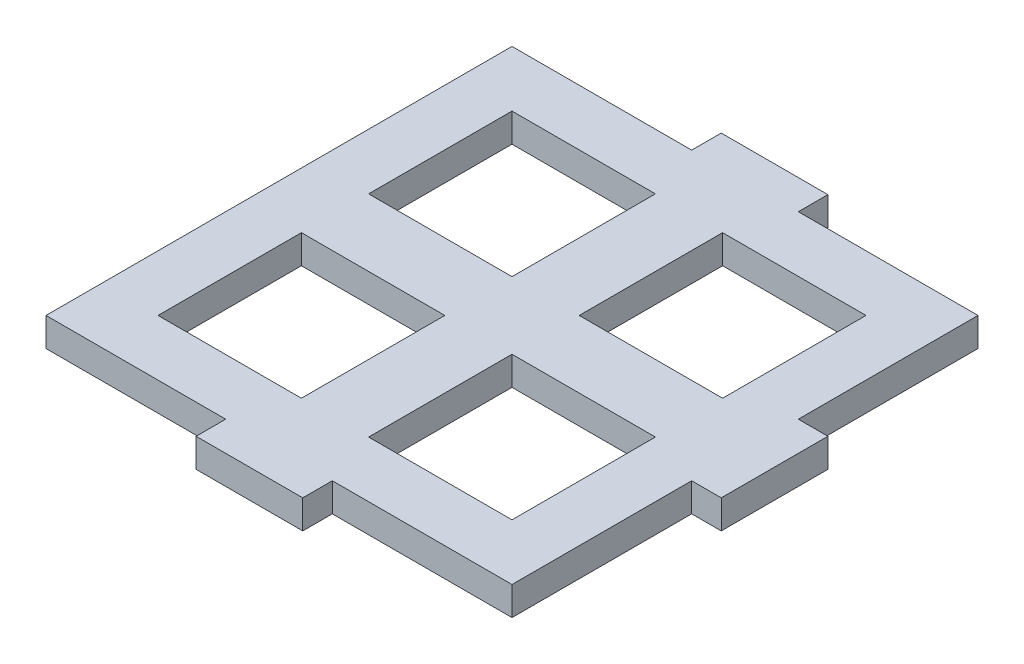
ISO-10303-21;
HEADER;
FILE_DESCRIPTION(('STEP AP214'),'2;1');
FILE_NAME('part.step','',(''),(''),'','','');
FILE_SCHEMA(('AUTOMOTIVE_DESIGN { 1 0 10303 214 1 1 1 1 }'));
ENDSEC;
DATA;
#1=APPLICATION_CONTEXT('core data for automotive mechanical design processes');
#2=APPLICATION_PROTOCOL_DEFINITION('international standard','automotive_design',2000,#1);
#3=PRODUCT_CONTEXT('',#1,'mechanical');
#4=PRODUCT('Part','Part','',(#3));
#5=PRODUCT_RELATED_PRODUCT_CATEGORY('part','',(#4));
#6=PRODUCT_DEFINITION_FORMATION('','',#4);
#7=PRODUCT_DEFINITION_CONTEXT('part definition',#1,'design');
#8=PRODUCT_DEFINITION('design','',#6,#7);
#9=PRODUCT_DEFINITION_SHAPE('','',#8);
#10=(LENGTH_UNIT() NAMED_UNIT(*) SI_UNIT(.MILLI.,.METRE.));
#11=(NAMED_UNIT(*) PLANE_ANGLE_UNIT() SI_UNIT($,.RADIAN.));
#12=(NAMED_UNIT(*) SI_UNIT($,.STERADIAN.) SOLID_ANGLE_UNIT());
#13=UNCERTAINTY_MEASURE_WITH_UNIT(LENGTH_MEASURE(1.E-05),#10,'distance_accuracy_value','');
#14=(GEOMETRIC_REPRESENTATION_CONTEXT(3) GLOBAL_UNCERTAINTY_ASSIGNED_CONTEXT((#13)) GLOBAL_UNIT_ASSIGNED_CONTEXT((#10,
#11,#12)) REPRESENTATION_CONTEXT('',''));
#15=CARTESIAN_POINT('',(0.,0.,0.));
#16=DIRECTION('',(0.,0.,1.));
#17=DIRECTION('',(1.,0.,0.));
#18=AXIS2_PLACEMENT_3D('',#15,#16,#17);
#19=CARTESIAN_POINT('',(21.016,0.,152.654));
#20=DIRECTION('',(0.,0.,1.));
#21=DIRECTION('',(1.,0.,0.));
#22=AXIS2_PLACEMENT_3D('',#19,#20,#21);
#23=PLANE('',#22);
#24=DIRECTION('',(1.,0.,0.));
#25=VECTOR('',#24,1.);
#26=CARTESIAN_POINT('',(21.016,4.064,152.654));
#27=LINE('',#26,#25);
#28=CARTESIAN_POINT('',(61.5925,4.064,152.654));
#29=VERTEX_POINT('',#28);
#30=CARTESIAN_POINT('',(87.056,4.064,152.654));
#31=VERTEX_POINT('',#30);
#32=EDGE_CURVE('E478',#29,#31,#27,.T.);
#33=ORIENTED_EDGE('',*,*,#32,.F.);
#34=DIRECTION('',(0.,-1.,0.));
#35=VECTOR('',#34,1.);
#36=CARTESIAN_POINT('',(61.5925,19.7473430747402,152.654));
#37=LINE('',#36,#35);
#38=CARTESIAN_POINT('',(61.5925,0.,152.654));
#39=VERTEX_POINT('',#38);
#40=EDGE_CURVE('E278',#29,#39,#37,.T.);
#41=ORIENTED_EDGE('',*,*,#40,.T.);
#42=DIRECTION('',(1.,0.,0.));
#43=VECTOR('',#42,1.);
#44=CARTESIAN_POINT('',(21.016,0.,152.654));
#45=LINE('',#44,#43);
#46=CARTESIAN_POINT('',(87.056,0.,152.654));
#47=VERTEX_POINT('',#46);
#48=EDGE_CURVE('E464',#39,#47,#45,.T.);
#49=ORIENTED_EDGE('',*,*,#48,.T.);
#50=DIRECTION('',(0.,1.,0.));
#51=VECTOR('',#50,1.);
#52=CARTESIAN_POINT('',(87.056,0.,152.654));
#53=LINE('',#52,#51);
#54=EDGE_CURVE('E488',#47,#31,#53,.T.);
#55=ORIENTED_EDGE('',*,*,#54,.T.);
#56=EDGE_LOOP('',(#33,#41,#49,#55));
#57=FACE_BOUND('',#56,.T.);
#58=ADVANCED_FACE('F34',(#57),#23,.T.);
#59=CARTESIAN_POINT('',(21.016,0.,86.614));
#60=DIRECTION('',(0.,0.,-1.));
#61=DIRECTION('',(-1.,0.,0.));
#62=AXIS2_PLACEMENT_3D('',#59,#60,#61);
#63=PLANE('',#62);
#64=DIRECTION('',(-1.,0.,0.));
#65=VECTOR('',#64,1.);
#66=CARTESIAN_POINT('',(21.016,4.064,86.614));
#67=LINE('',#66,#65);
#68=CARTESIAN_POINT('',(46.4795,4.064,86.614));
#69=VERTEX_POINT('',#68);
#70=CARTESIAN_POINT('',(21.016,4.064,86.614));
#71=VERTEX_POINT('',#70);
#72=EDGE_CURVE('E484',#69,#71,#67,.T.);
#73=ORIENTED_EDGE('',*,*,#72,.F.);
#74=DIRECTION('',(0.,-1.,0.));
#75=VECTOR('',#74,1.);
#76=CARTESIAN_POINT('',(46.4795,19.7473430747402,86.614));
#77=LINE('',#76,#75);
#78=CARTESIAN_POINT('',(46.4795,0.,86.614));
#79=VERTEX_POINT('',#78);
#80=EDGE_CURVE('E287',#69,#79,#77,.T.);
#81=ORIENTED_EDGE('',*,*,#80,.T.);
#82=DIRECTION('',(-1.,0.,0.));
#83=VECTOR('',#82,1.);
#84=CARTESIAN_POINT('',(21.016,0.,86.614));
#85=LINE('',#84,#83);
#86=CARTESIAN_POINT('',(21.016,0.,86.614));
#87=VERTEX_POINT('',#86);
#88=EDGE_CURVE('E473',#79,#87,#85,.T.);
#89=ORIENTED_EDGE('',*,*,#88,.T.);
#90=DIRECTION('',(0.,1.,0.));
#91=VECTOR('',#90,1.);
#92=CARTESIAN_POINT('',(21.016,0.,86.614));
#93=LINE('',#92,#91);
#94=EDGE_CURVE('E11',#87,#71,#93,.T.);
#95=ORIENTED_EDGE('',*,*,#94,.T.);
#96=EDGE_LOOP('',(#73,#81,#89,#95));
#97=FACE_BOUND('',#96,.T.);
#98=ADVANCED_FACE('F503',(#97),#63,.T.);
#99=CARTESIAN_POINT('',(87.056,0.,86.614));
#100=DIRECTION('',(1.,0.,0.));
#101=DIRECTION('',(0.,0.,-1.));
#102=AXIS2_PLACEMENT_3D('',#99,#100,#101);
#103=PLANE('',#102);
#104=DIRECTION('',(0.,0.,-1.));
#105=VECTOR('',#104,1.);
#106=CARTESIAN_POINT('',(87.056,4.064,86.614));
#107=LINE('',#106,#105);
#108=CARTESIAN_POINT('',(87.0559999999999,4.064,112.0775));
#109=VERTEX_POINT('',#108);
#110=CARTESIAN_POINT('',(87.056,4.064,86.614));
#111=VERTEX_POINT('',#110);
#112=EDGE_CURVE('E480',#109,#111,#107,.T.);
#113=ORIENTED_EDGE('',*,*,#112,.F.);
#114=DIRECTION('',(0.,-1.,0.));
#115=VECTOR('',#114,1.);
#116=CARTESIAN_POINT('',(87.0559999999999,19.7473430747402,112.0775));
#117=LINE('',#116,#115);
#118=CARTESIAN_POINT('',(87.056,0.,112.0775));
#119=VERTEX_POINT('',#118);
#120=EDGE_CURVE('E326',#109,#119,#117,.T.);
#121=ORIENTED_EDGE('',*,*,#120,.T.);
#122=DIRECTION('',(0.,0.,-1.));
#123=VECTOR('',#122,1.);
#124=CARTESIAN_POINT('',(87.056,0.,86.614));
#125=LINE('',#124,#123);
#126=CARTESIAN_POINT('',(87.056,0.,86.614));
#127=VERTEX_POINT('',#126);
#128=EDGE_CURVE('E469',#119,#127,#125,.T.);
#129=ORIENTED_EDGE('',*,*,#128,.T.);
#130=DIRECTION('',(0.,1.,0.));
#131=VECTOR('',#130,1.);
#132=CARTESIAN_POINT('',(87.056,0.,86.614));
#133=LINE('',#132,#131);
#134=EDGE_CURVE('E43',#127,#111,#133,.T.);
#135=ORIENTED_EDGE('',*,*,#134,.T.);
#136=EDGE_LOOP('',(#113,#121,#129,#135));
#137=FACE_BOUND('',#136,.T.);
#138=ADVANCED_FACE('F523',(#137),#103,.T.);
#139=CARTESIAN_POINT('',(21.016,0.,86.614));
#140=DIRECTION('',(-1.,0.,0.));
#141=DIRECTION('',(0.,0.,1.));
#142=AXIS2_PLACEMENT_3D('',#139,#140,#141);
#143=PLANE('',#142);
#144=DIRECTION('',(0.,0.,1.));
#145=VECTOR('',#144,1.);
#146=CARTESIAN_POINT('',(21.016,4.064,86.614));
#147=LINE('',#146,#145);
#148=CARTESIAN_POINT('',(21.016,4.064,152.654));
#149=VERTEX_POINT('',#148);
#150=EDGE_CURVE('E454',#71,#149,#147,.T.);
#151=ORIENTED_EDGE('',*,*,#150,.F.);
#152=ORIENTED_EDGE('',*,*,#94,.F.);
#153=DIRECTION('',(0.,0.,1.));
#154=VECTOR('',#153,1.);
#155=CARTESIAN_POINT('',(21.016,0.,86.614));
#156=LINE('',#155,#154);
#157=CARTESIAN_POINT('',(21.016,0.,152.654));
#158=VERTEX_POINT('',#157);
#159=EDGE_CURVE('E461',#87,#158,#156,.T.);
#160=ORIENTED_EDGE('',*,*,#159,.T.);
#161=DIRECTION('',(0.,1.,0.));
#162=VECTOR('',#161,1.);
#163=CARTESIAN_POINT('',(21.016,0.,152.654));
#164=LINE('',#163,#162);
#165=EDGE_CURVE('E38',#158,#149,#164,.T.);
#166=ORIENTED_EDGE('',*,*,#165,.T.);
#167=EDGE_LOOP('',(#151,#152,#160,#166));
#168=FACE_BOUND('',#167,.T.);
#169=ADVANCED_FACE('F36',(#168),#143,.T.);
#170=DIRECTION('',(0.,-1.,0.));
#171=VECTOR('',#170,1.);
#172=CARTESIAN_POINT('',(61.5925,19.7473430747402,86.614));
#173=LINE('',#172,#171);
#174=CARTESIAN_POINT('',(61.5925,4.064,86.614));
#175=VERTEX_POINT('',#174);
#176=CARTESIAN_POINT('',(61.5925,0.,86.614));
#177=VERTEX_POINT('',#176);
#178=EDGE_CURVE('E293',#175,#177,#173,.T.);
#179=ORIENTED_EDGE('',*,*,#178,.F.);
#180=EDGE_CURVE('E465',#111,#175,#67,.T.);
#181=ORIENTED_EDGE('',*,*,#180,.F.);
#182=ORIENTED_EDGE('',*,*,#134,.F.);
#183=EDGE_CURVE('E474',#127,#177,#85,.T.);
#184=ORIENTED_EDGE('',*,*,#183,.T.);
#185=EDGE_LOOP('',(#179,#181,#182,#184));
#186=FACE_BOUND('',#185,.T.);
#187=ADVANCED_FACE('F525',(#186),#63,.T.);
#188=DIRECTION('',(0.,-1.,0.));
#189=VECTOR('',#188,1.);
#190=CARTESIAN_POINT('',(87.0559999999999,19.7473430747402,127.1905));
#191=LINE('',#190,#189);
#192=CARTESIAN_POINT('',(87.0559999999999,4.064,127.1905));
#193=VERTEX_POINT('',#192);
#194=CARTESIAN_POINT('',(87.0559999999999,0.,127.1905));
#195=VERTEX_POINT('',#194);
#196=EDGE_CURVE('E317',#193,#195,#191,.T.);
#197=ORIENTED_EDGE('',*,*,#196,.F.);
#198=EDGE_CURVE('E481',#31,#193,#107,.T.);
#199=ORIENTED_EDGE('',*,*,#198,.F.);
#200=ORIENTED_EDGE('',*,*,#54,.F.);
#201=EDGE_CURVE('E470',#47,#195,#125,.T.);
#202=ORIENTED_EDGE('',*,*,#201,.T.);
#203=EDGE_LOOP('',(#197,#199,#200,#202));
#204=FACE_BOUND('',#203,.T.);
#205=ADVANCED_FACE('F511',(#204),#103,.T.);
#206=DIRECTION('',(0.,-1.,0.));
#207=VECTOR('',#206,1.);
#208=CARTESIAN_POINT('',(46.4795,19.7473430747402,152.654));
#209=LINE('',#208,#207);
#210=CARTESIAN_POINT('',(46.4795,4.064,152.654));
#211=VERTEX_POINT('',#210);
#212=CARTESIAN_POINT('',(46.4795,0.,152.654));
#213=VERTEX_POINT('',#212);
#214=EDGE_CURVE('E257',#211,#213,#209,.T.);
#215=ORIENTED_EDGE('',*,*,#214,.F.);
#216=EDGE_CURVE('E254',#149,#211,#27,.T.);
#217=ORIENTED_EDGE('',*,*,#216,.F.);
#218=ORIENTED_EDGE('',*,*,#165,.F.);
#219=EDGE_CURVE('E466',#158,#213,#45,.T.);
#220=ORIENTED_EDGE('',*,*,#219,.T.);
#221=EDGE_LOOP('',(#215,#217,#218,#220));
#222=FACE_BOUND('',#221,.T.);
#223=ADVANCED_FACE('F500',(#222),#23,.T.);
#224=CARTESIAN_POINT('',(0.,0.,0.));
#225=DIRECTION('',(0.,1.,0.));
#226=DIRECTION('',(0.,0.,1.));
#227=AXIS2_PLACEMENT_3D('',#224,#225,#226);
#228=PLANE('',#227);
#229=DIRECTION('',(1.,0.,0.));
#230=VECTOR('',#229,1.);
#231=CARTESIAN_POINT('',(58.7984999999999,0.,144.7165));
#232=LINE('',#231,#230);
#233=CARTESIAN_POINT('',(58.7984999999999,0.,144.7165));
#234=VERTEX_POINT('',#233);
#235=CARTESIAN_POINT('',(79.1185,0.,144.7165));
#236=VERTEX_POINT('',#235);
#237=EDGE_CURVE('E343',#234,#236,#232,.T.);
#238=ORIENTED_EDGE('',*,*,#237,.T.);
#239=DIRECTION('',(0.,0.,-1.));
#240=VECTOR('',#239,1.);
#241=CARTESIAN_POINT('',(79.1184999999999,0.,124.3965));
#242=LINE('',#241,#240);
#243=CARTESIAN_POINT('',(79.1184999999999,0.,124.3965));
#244=VERTEX_POINT('',#243);
#245=EDGE_CURVE('E333',#236,#244,#242,.T.);
#246=ORIENTED_EDGE('',*,*,#245,.T.);
#247=DIRECTION('',(-1.,0.,0.));
#248=VECTOR('',#247,1.);
#249=CARTESIAN_POINT('',(58.7984999999999,0.,124.3965));
#250=LINE('',#249,#248);
#251=CARTESIAN_POINT('',(58.7984999999999,0.,124.3965));
#252=VERTEX_POINT('',#251);
#253=EDGE_CURVE('E336',#244,#252,#250,.T.);
#254=ORIENTED_EDGE('',*,*,#253,.T.);
#255=DIRECTION('',(0.,0.,1.));
#256=VECTOR('',#255,1.);
#257=CARTESIAN_POINT('',(58.7984999999999,0.,124.3965));
#258=LINE('',#257,#256);
#259=EDGE_CURVE('E340',#252,#234,#258,.T.);
#260=ORIENTED_EDGE('',*,*,#259,.T.);
#261=EDGE_LOOP('',(#238,#246,#254,#260));
#262=FACE_BOUND('',#261,.T.);
#263=DIRECTION('',(1.,0.,0.));
#264=VECTOR('',#263,1.);
#265=CARTESIAN_POINT('',(28.9534999999999,0.,144.7165));
#266=LINE('',#265,#264);
#267=CARTESIAN_POINT('',(28.9534999999999,0.,144.7165));
#268=VERTEX_POINT('',#267);
#269=CARTESIAN_POINT('',(49.2735,0.,144.7165));
#270=VERTEX_POINT('',#269);
#271=EDGE_CURVE('E375',#268,#270,#266,.T.);
#272=ORIENTED_EDGE('',*,*,#271,.T.);
#273=DIRECTION('',(0.,0.,-1.));
#274=VECTOR('',#273,1.);
#275=CARTESIAN_POINT('',(49.2734999999999,0.,124.3965));
#276=LINE('',#275,#274);
#277=CARTESIAN_POINT('',(49.2734999999999,0.,124.3965));
#278=VERTEX_POINT('',#277);
#279=EDGE_CURVE('E365',#270,#278,#276,.T.);
#280=ORIENTED_EDGE('',*,*,#279,.T.);
#281=DIRECTION('',(-1.,0.,0.));
#282=VECTOR('',#281,1.);
#283=CARTESIAN_POINT('',(28.9534999999999,0.,124.3965));
#284=LINE('',#283,#282);
#285=CARTESIAN_POINT('',(28.9534999999999,0.,124.3965));
#286=VERTEX_POINT('',#285);
#287=EDGE_CURVE('E368',#278,#286,#284,.T.);
#288=ORIENTED_EDGE('',*,*,#287,.T.);
#289=DIRECTION('',(0.,0.,1.));
#290=VECTOR('',#289,1.);
#291=CARTESIAN_POINT('',(28.9534999999999,0.,124.3965));
#292=LINE('',#291,#290);
#293=EDGE_CURVE('E372',#286,#268,#292,.T.);
#294=ORIENTED_EDGE('',*,*,#293,.T.);
#295=EDGE_LOOP('',(#272,#280,#288,#294));
#296=FACE_BOUND('',#295,.T.);
#297=DIRECTION('',(1.,0.,0.));
#298=VECTOR('',#297,1.);
#299=CARTESIAN_POINT('',(58.7984999999999,0.,114.8715));
#300=LINE('',#299,#298);
#301=CARTESIAN_POINT('',(58.7984999999999,0.,114.8715));
#302=VERTEX_POINT('',#301);
#303=CARTESIAN_POINT('',(79.1184999999999,0.,114.8715));
#304=VERTEX_POINT('',#303);
#305=EDGE_CURVE('E407',#302,#304,#300,.T.);
#306=ORIENTED_EDGE('',*,*,#305,.T.);
#307=DIRECTION('',(0.,0.,-1.));
#308=VECTOR('',#307,1.);
#309=CARTESIAN_POINT('',(79.1184999999999,0.,94.5514999999999));
#310=LINE('',#309,#308);
#311=CARTESIAN_POINT('',(79.1184999999999,0.,94.5514999999999));
#312=VERTEX_POINT('',#311);
#313=EDGE_CURVE('E397',#304,#312,#310,.T.);
#314=ORIENTED_EDGE('',*,*,#313,.T.);
#315=DIRECTION('',(-1.,0.,0.));
#316=VECTOR('',#315,1.);
#317=CARTESIAN_POINT('',(58.7984999999999,0.,94.5514999999999));
#318=LINE('',#317,#316);
#319=CARTESIAN_POINT('',(58.7984999999999,0.,94.5514999999999));
#320=VERTEX_POINT('',#319);
#321=EDGE_CURVE('E400',#312,#320,#318,.T.);
#322=ORIENTED_EDGE('',*,*,#321,.T.);
#323=DIRECTION('',(0.,0.,1.));
#324=VECTOR('',#323,1.);
#325=CARTESIAN_POINT('',(58.7984999999999,0.,94.5514999999999));
#326=LINE('',#325,#324);
#327=EDGE_CURVE('E404',#320,#302,#326,.T.);
#328=ORIENTED_EDGE('',*,*,#327,.T.);
#329=EDGE_LOOP('',(#306,#314,#322,#328));
#330=FACE_BOUND('',#329,.T.);
#331=DIRECTION('',(-1.,0.,0.));
#332=VECTOR('',#331,1.);
#333=CARTESIAN_POINT('',(49.2734999999999,0.,94.5514999999999));
#334=LINE('',#333,#332);
#335=CARTESIAN_POINT('',(49.2734999999999,0.,94.5514999999999));
#336=VERTEX_POINT('',#335);
#337=CARTESIAN_POINT('',(28.9534999999999,0.,94.5514999999999));
#338=VERTEX_POINT('',#337);
#339=EDGE_CURVE('E439',#336,#338,#334,.T.);
#340=ORIENTED_EDGE('',*,*,#339,.T.);
#341=DIRECTION('',(0.,0.,1.));
#342=VECTOR('',#341,1.);
#343=CARTESIAN_POINT('',(28.9534999999999,0.,94.5514999999999));
#344=LINE('',#343,#342);
#345=CARTESIAN_POINT('',(28.9534999999999,0.,114.8715));
#346=VERTEX_POINT('',#345);
#347=EDGE_CURVE('E429',#338,#346,#344,.T.);
#348=ORIENTED_EDGE('',*,*,#347,.T.);
#349=DIRECTION('',(1.,0.,0.));
#350=VECTOR('',#349,1.);
#351=CARTESIAN_POINT('',(49.2734999999999,0.,114.8715));
#352=LINE('',#351,#350);
#353=CARTESIAN_POINT('',(49.2734999999999,0.,114.8715));
#354=VERTEX_POINT('',#353);
#355=EDGE_CURVE('E432',#346,#354,#352,.T.);
#356=ORIENTED_EDGE('',*,*,#355,.T.);
#357=DIRECTION('',(0.,0.,-1.));
#358=VECTOR('',#357,1.);
#359=CARTESIAN_POINT('',(49.2734999999999,0.,94.5514999999999));
#360=LINE('',#359,#358);
#361=EDGE_CURVE('E436',#354,#336,#360,.T.);
#362=ORIENTED_EDGE('',*,*,#361,.T.);
#363=EDGE_LOOP('',(#340,#348,#356,#362));
#364=FACE_BOUND('',#363,.T.);
#365=ORIENTED_EDGE('',*,*,#159,.F.);
#366=ORIENTED_EDGE('',*,*,#88,.F.);
#367=DIRECTION('',(0.,0.,-1.));
#368=VECTOR('',#367,1.);
#369=CARTESIAN_POINT('',(46.4795,0.,82.423));
#370=LINE('',#369,#368);
#371=CARTESIAN_POINT('',(46.4795,0.,82.423));
#372=VERTEX_POINT('',#371);
#373=EDGE_CURVE('E59',#79,#372,#370,.T.);
#374=ORIENTED_EDGE('',*,*,#373,.T.);
#375=DIRECTION('',(1.,0.,0.));
#376=VECTOR('',#375,1.);
#377=CARTESIAN_POINT('',(61.5925,0.,82.423));
#378=LINE('',#377,#376);
#379=CARTESIAN_POINT('',(61.5925,0.,82.423));
#380=VERTEX_POINT('',#379);
#381=EDGE_CURVE('E284',#372,#380,#378,.T.);
#382=ORIENTED_EDGE('',*,*,#381,.T.);
#383=DIRECTION('',(0.,0.,1.));
#384=VECTOR('',#383,1.);
#385=CARTESIAN_POINT('',(61.5925,0.,82.423));
#386=LINE('',#385,#384);
#387=EDGE_CURVE('E283',#380,#177,#386,.T.);
#388=ORIENTED_EDGE('',*,*,#387,.T.);
#389=ORIENTED_EDGE('',*,*,#183,.F.);
#390=ORIENTED_EDGE('',*,*,#128,.F.);
#391=DIRECTION('',(1.,0.,0.));
#392=VECTOR('',#391,1.);
#393=CARTESIAN_POINT('',(91.2469999999999,0.,112.0775));
#394=LINE('',#393,#392);
#395=CARTESIAN_POINT('',(91.2469999999999,0.,112.0775));
#396=VERTEX_POINT('',#395);
#397=EDGE_CURVE('E307',#119,#396,#394,.T.);
#398=ORIENTED_EDGE('',*,*,#397,.T.);
#399=DIRECTION('',(0.,0.,1.));
#400=VECTOR('',#399,1.);
#401=CARTESIAN_POINT('',(91.2469999999999,0.,112.0775));
#402=LINE('',#401,#400);
#403=CARTESIAN_POINT('',(91.2469999999999,0.,127.1905));
#404=VERTEX_POINT('',#403);
#405=EDGE_CURVE('E306',#396,#404,#402,.T.);
#406=ORIENTED_EDGE('',*,*,#405,.T.);
#407=DIRECTION('',(-1.,0.,0.));
#408=VECTOR('',#407,1.);
#409=CARTESIAN_POINT('',(91.2469999999999,0.,127.1905));
#410=LINE('',#409,#408);
#411=EDGE_CURVE('E311',#404,#195,#410,.T.);
#412=ORIENTED_EDGE('',*,*,#411,.T.);
#413=ORIENTED_EDGE('',*,*,#201,.F.);
#414=ORIENTED_EDGE('',*,*,#48,.F.);
#415=DIRECTION('',(0.,0.,1.));
#416=VECTOR('',#415,1.);
#417=CARTESIAN_POINT('',(61.5925,0.,152.654));
#418=LINE('',#417,#416);
#419=CARTESIAN_POINT('',(61.5925,0.,156.845));
#420=VERTEX_POINT('',#419);
#421=EDGE_CURVE('E51',#39,#420,#418,.T.);
#422=ORIENTED_EDGE('',*,*,#421,.T.);
#423=DIRECTION('',(-1.,0.,0.));
#424=VECTOR('',#423,1.);
#425=CARTESIAN_POINT('',(61.5925,0.,156.845));
#426=LINE('',#425,#424);
#427=CARTESIAN_POINT('',(46.4795,0.,156.845));
#428=VERTEX_POINT('',#427);
#429=EDGE_CURVE('E272',#420,#428,#426,.T.);
#430=ORIENTED_EDGE('',*,*,#429,.T.);
#431=DIRECTION('',(0.,0.,-1.));
#432=VECTOR('',#431,1.);
#433=CARTESIAN_POINT('',(46.4795,0.,152.654));
#434=LINE('',#433,#432);
#435=EDGE_CURVE('E263',#428,#213,#434,.T.);
#436=ORIENTED_EDGE('',*,*,#435,.T.);
#437=ORIENTED_EDGE('',*,*,#219,.F.);
#438=EDGE_LOOP('',(#365,#366,#374,#382,#388,#389,#390,#398,#406,#412,#413,#414,#422,#430,#436,#437));
#439=FACE_BOUND('',#438,.T.);
#440=ADVANCED_FACE('F506',(#262,#296,#330,#364,#439),#228,.F.);
#441=CARTESIAN_POINT('',(0.,4.064,0.));
#442=DIRECTION('',(0.,1.,0.));
#443=DIRECTION('',(0.,0.,1.));
#444=AXIS2_PLACEMENT_3D('',#441,#442,#443);
#445=PLANE('',#444);
#446=DIRECTION('',(0.,0.,-1.));
#447=VECTOR('',#446,1.);
#448=CARTESIAN_POINT('',(79.1184999999999,4.064,124.3965));
#449=LINE('',#448,#447);
#450=CARTESIAN_POINT('',(79.1185,4.064,144.7165));
#451=VERTEX_POINT('',#450);
#452=CARTESIAN_POINT('',(79.1184999999999,4.064,124.3965));
#453=VERTEX_POINT('',#452);
#454=EDGE_CURVE('E332',#451,#453,#449,.T.);
#455=ORIENTED_EDGE('',*,*,#454,.F.);
#456=DIRECTION('',(1.,0.,0.));
#457=VECTOR('',#456,1.);
#458=CARTESIAN_POINT('',(58.7984999999999,4.064,144.7165));
#459=LINE('',#458,#457);
#460=CARTESIAN_POINT('',(58.7984999999999,4.064,144.7165));
#461=VERTEX_POINT('',#460);
#462=EDGE_CURVE('E337',#461,#451,#459,.T.);
#463=ORIENTED_EDGE('',*,*,#462,.F.);
#464=DIRECTION('',(0.,0.,1.));
#465=VECTOR('',#464,1.);
#466=CARTESIAN_POINT('',(58.7984999999999,4.064,124.3965));
#467=LINE('',#466,#465);
#468=CARTESIAN_POINT('',(58.7984999999999,4.064,124.3965));
#469=VERTEX_POINT('',#468);
#470=EDGE_CURVE('E351',#469,#461,#467,.T.);
#471=ORIENTED_EDGE('',*,*,#470,.F.);
#472=DIRECTION('',(-1.,0.,0.));
#473=VECTOR('',#472,1.);
#474=CARTESIAN_POINT('',(58.7984999999999,4.064,124.3965));
#475=LINE('',#474,#473);
#476=EDGE_CURVE('E348',#453,#469,#475,.T.);
#477=ORIENTED_EDGE('',*,*,#476,.F.);
#478=EDGE_LOOP('',(#455,#463,#471,#477));
#479=FACE_BOUND('',#478,.T.);
#480=DIRECTION('',(0.,0.,-1.));
#481=VECTOR('',#480,1.);
#482=CARTESIAN_POINT('',(49.2734999999999,4.064,124.3965));
#483=LINE('',#482,#481);
#484=CARTESIAN_POINT('',(49.2735,4.064,144.7165));
#485=VERTEX_POINT('',#484);
#486=CARTESIAN_POINT('',(49.2734999999999,4.064,124.3965));
#487=VERTEX_POINT('',#486);
#488=EDGE_CURVE('E358',#485,#487,#483,.T.);
#489=ORIENTED_EDGE('',*,*,#488,.F.);
#490=DIRECTION('',(1.,0.,0.));
#491=VECTOR('',#490,1.);
#492=CARTESIAN_POINT('',(28.9534999999999,4.064,144.7165));
#493=LINE('',#492,#491);
#494=CARTESIAN_POINT('',(28.9534999999999,4.064,144.7165));
#495=VERTEX_POINT('',#494);
#496=EDGE_CURVE('E369',#495,#485,#493,.T.);
#497=ORIENTED_EDGE('',*,*,#496,.F.);
#498=DIRECTION('',(0.,0.,1.));
#499=VECTOR('',#498,1.);
#500=CARTESIAN_POINT('',(28.9534999999999,4.064,124.3965));
#501=LINE('',#500,#499);
#502=CARTESIAN_POINT('',(28.9534999999999,4.064,124.3965));
#503=VERTEX_POINT('',#502);
#504=EDGE_CURVE('E383',#503,#495,#501,.T.);
#505=ORIENTED_EDGE('',*,*,#504,.F.);
#506=DIRECTION('',(-1.,0.,0.));
#507=VECTOR('',#506,1.);
#508=CARTESIAN_POINT('',(28.9534999999999,4.064,124.3965));
#509=LINE('',#508,#507);
#510=EDGE_CURVE('E380',#487,#503,#509,.T.);
#511=ORIENTED_EDGE('',*,*,#510,.F.);
#512=EDGE_LOOP('',(#489,#497,#505,#511));
#513=FACE_BOUND('',#512,.T.);
#514=DIRECTION('',(0.,0.,-1.));
#515=VECTOR('',#514,1.);
#516=CARTESIAN_POINT('',(79.1184999999999,4.064,94.5514999999999));
#517=LINE('',#516,#515);
#518=CARTESIAN_POINT('',(79.1184999999999,4.064,114.8715));
#519=VERTEX_POINT('',#518);
#520=CARTESIAN_POINT('',(79.1184999999999,4.064,94.5514999999999));
#521=VERTEX_POINT('',#520);
#522=EDGE_CURVE('E390',#519,#521,#517,.T.);
#523=ORIENTED_EDGE('',*,*,#522,.F.);
#524=DIRECTION('',(1.,0.,0.));
#525=VECTOR('',#524,1.);
#526=CARTESIAN_POINT('',(58.7984999999999,4.064,114.8715));
#527=LINE('',#526,#525);
#528=CARTESIAN_POINT('',(58.7984999999999,4.064,114.8715));
#529=VERTEX_POINT('',#528);
#530=EDGE_CURVE('E401',#529,#519,#527,.T.);
#531=ORIENTED_EDGE('',*,*,#530,.F.);
#532=DIRECTION('',(0.,0.,1.));
#533=VECTOR('',#532,1.);
#534=CARTESIAN_POINT('',(58.7984999999999,4.064,94.5514999999999));
#535=LINE('',#534,#533);
#536=CARTESIAN_POINT('',(58.7984999999999,4.064,94.5514999999999));
#537=VERTEX_POINT('',#536);
#538=EDGE_CURVE('E415',#537,#529,#535,.T.);
#539=ORIENTED_EDGE('',*,*,#538,.F.);
#540=DIRECTION('',(-1.,0.,0.));
#541=VECTOR('',#540,1.);
#542=CARTESIAN_POINT('',(58.7984999999999,4.064,94.5514999999999));
#543=LINE('',#542,#541);
#544=EDGE_CURVE('E412',#521,#537,#543,.T.);
#545=ORIENTED_EDGE('',*,*,#544,.F.);
#546=EDGE_LOOP('',(#523,#531,#539,#545));
#547=FACE_BOUND('',#546,.T.);
#548=DIRECTION('',(0.,0.,1.));
#549=VECTOR('',#548,1.);
#550=CARTESIAN_POINT('',(28.9534999999999,4.064,94.5514999999999));
#551=LINE('',#550,#549);
#552=CARTESIAN_POINT('',(28.9534999999999,4.064,94.5514999999999));
#553=VERTEX_POINT('',#552);
#554=CARTESIAN_POINT('',(28.9534999999999,4.064,114.8715));
#555=VERTEX_POINT('',#554);
#556=EDGE_CURVE('E422',#553,#555,#551,.T.);
#557=ORIENTED_EDGE('',*,*,#556,.F.);
#558=DIRECTION('',(-1.,0.,0.));
#559=VECTOR('',#558,1.);
#560=CARTESIAN_POINT('',(49.2734999999999,4.064,94.5514999999999));
#561=LINE('',#560,#559);
#562=CARTESIAN_POINT('',(49.2734999999999,4.064,94.5514999999999));
#563=VERTEX_POINT('',#562);
#564=EDGE_CURVE('E433',#563,#553,#561,.T.);
#565=ORIENTED_EDGE('',*,*,#564,.F.);
#566=DIRECTION('',(0.,0.,-1.));
#567=VECTOR('',#566,1.);
#568=CARTESIAN_POINT('',(49.2734999999999,4.064,94.5514999999999));
#569=LINE('',#568,#567);
#570=CARTESIAN_POINT('',(49.2734999999999,4.064,114.8715));
#571=VERTEX_POINT('',#570);
#572=EDGE_CURVE('E447',#571,#563,#569,.T.);
#573=ORIENTED_EDGE('',*,*,#572,.F.);
#574=DIRECTION('',(1.,0.,0.));
#575=VECTOR('',#574,1.);
#576=CARTESIAN_POINT('',(49.2734999999999,4.064,114.8715));
#577=LINE('',#576,#575);
#578=EDGE_CURVE('E444',#555,#571,#577,.T.);
#579=ORIENTED_EDGE('',*,*,#578,.F.);
#580=EDGE_LOOP('',(#557,#565,#573,#579));
#581=FACE_BOUND('',#580,.T.);
#582=ORIENTED_EDGE('',*,*,#150,.T.);
#583=ORIENTED_EDGE('',*,*,#216,.T.);
#584=DIRECTION('',(0.,0.,-1.));
#585=VECTOR('',#584,1.);
#586=CARTESIAN_POINT('',(46.4795,4.064,152.654));
#587=LINE('',#586,#585);
#588=CARTESIAN_POINT('',(46.4795,4.064,156.845));
#589=VERTEX_POINT('',#588);
#590=EDGE_CURVE('E246',#589,#211,#587,.T.);
#591=ORIENTED_EDGE('',*,*,#590,.F.);
#592=DIRECTION('',(-1.,0.,0.));
#593=VECTOR('',#592,1.);
#594=CARTESIAN_POINT('',(61.5925,4.064,156.845));
#595=LINE('',#594,#593);
#596=CARTESIAN_POINT('',(61.5925,4.064,156.845));
#597=VERTEX_POINT('',#596);
#598=EDGE_CURVE('E251',#597,#589,#595,.T.);
#599=ORIENTED_EDGE('',*,*,#598,.F.);
#600=DIRECTION('',(0.,0.,1.));
#601=VECTOR('',#600,1.);
#602=CARTESIAN_POINT('',(61.5925,4.064,152.654));
#603=LINE('',#602,#601);
#604=EDGE_CURVE('E277',#29,#597,#603,.T.);
#605=ORIENTED_EDGE('',*,*,#604,.F.);
#606=ORIENTED_EDGE('',*,*,#32,.T.);
#607=ORIENTED_EDGE('',*,*,#198,.T.);
#608=DIRECTION('',(-1.,0.,0.));
#609=VECTOR('',#608,1.);
#610=CARTESIAN_POINT('',(91.2469999999999,4.064,127.1905));
#611=LINE('',#610,#609);
#612=CARTESIAN_POINT('',(91.2469999999999,4.064,127.1905));
#613=VERTEX_POINT('',#612);
#614=EDGE_CURVE('E310',#613,#193,#611,.T.);
#615=ORIENTED_EDGE('',*,*,#614,.F.);
#616=DIRECTION('',(0.,0.,1.));
#617=VECTOR('',#616,1.);
#618=CARTESIAN_POINT('',(91.2469999999999,4.064,112.0775));
#619=LINE('',#618,#617);
#620=CARTESIAN_POINT('',(91.2469999999999,4.064,112.0775));
#621=VERTEX_POINT('',#620);
#622=EDGE_CURVE('E318',#621,#613,#619,.T.);
#623=ORIENTED_EDGE('',*,*,#622,.F.);
#624=DIRECTION('',(1.,0.,0.));
#625=VECTOR('',#624,1.);
#626=CARTESIAN_POINT('',(91.2469999999999,4.064,112.0775));
#627=LINE('',#626,#625);
#628=EDGE_CURVE('E323',#109,#621,#627,.T.);
#629=ORIENTED_EDGE('',*,*,#628,.F.);
#630=ORIENTED_EDGE('',*,*,#112,.T.);
#631=ORIENTED_EDGE('',*,*,#180,.T.);
#632=DIRECTION('',(0.,0.,1.));
#633=VECTOR('',#632,1.);
#634=CARTESIAN_POINT('',(61.5925,4.064,82.423));
#635=LINE('',#634,#633);
#636=CARTESIAN_POINT('',(61.5925,4.064,82.423));
#637=VERTEX_POINT('',#636);
#638=EDGE_CURVE('E291',#637,#175,#635,.T.);
#639=ORIENTED_EDGE('',*,*,#638,.F.);
#640=DIRECTION('',(1.,0.,0.));
#641=VECTOR('',#640,1.);
#642=CARTESIAN_POINT('',(61.5925,4.064,82.423));
#643=LINE('',#642,#641);
#644=CARTESIAN_POINT('',(46.4795,4.064,82.423));
#645=VERTEX_POINT('',#644);
#646=EDGE_CURVE('E295',#645,#637,#643,.T.);
#647=ORIENTED_EDGE('',*,*,#646,.F.);
#648=DIRECTION('',(0.,0.,-1.));
#649=VECTOR('',#648,1.);
#650=CARTESIAN_POINT('',(46.4795,4.064,82.423));
#651=LINE('',#650,#649);
#652=EDGE_CURVE('E299',#69,#645,#651,.T.);
#653=ORIENTED_EDGE('',*,*,#652,.F.);
#654=ORIENTED_EDGE('',*,*,#72,.T.);
#655=EDGE_LOOP('',(#582,#583,#591,#599,#605,#606,#607,#615,#623,#629,#630,#631,#639,#647,#653,#654));
#656=FACE_BOUND('',#655,.T.);
#657=ADVANCED_FACE('F249',(#479,#513,#547,#581,#656),#445,.T.);
#658=CARTESIAN_POINT('',(28.9534999999999,0.,94.5514999999999));
#659=DIRECTION('',(-1.,0.,0.));
#660=DIRECTION('',(0.,0.,1.));
#661=AXIS2_PLACEMENT_3D('',#658,#659,#660);
#662=PLANE('',#661);
#663=ORIENTED_EDGE('',*,*,#556,.T.);
#664=DIRECTION('',(0.,1.,0.));
#665=VECTOR('',#664,1.);
#666=CARTESIAN_POINT('',(28.9534999999999,0.,114.8715));
#667=LINE('',#666,#665);
#668=EDGE_CURVE('E442',#346,#555,#667,.T.);
#669=ORIENTED_EDGE('',*,*,#668,.F.);
#670=ORIENTED_EDGE('',*,*,#347,.F.);
#671=DIRECTION('',(0.,1.,0.));
#672=VECTOR('',#671,1.);
#673=CARTESIAN_POINT('',(28.9534999999999,0.,94.5514999999999));
#674=LINE('',#673,#672);
#675=EDGE_CURVE('E452',#338,#553,#674,.T.);
#676=ORIENTED_EDGE('',*,*,#675,.T.);
#677=EDGE_LOOP('',(#663,#669,#670,#676));
#678=FACE_BOUND('',#677,.T.);
#679=ADVANCED_FACE('F634',(#678),#662,.F.);
#680=CARTESIAN_POINT('',(49.2734999999999,0.,94.5514999999999));
#681=DIRECTION('',(0.,0.,-1.));
#682=DIRECTION('',(-1.,0.,0.));
#683=AXIS2_PLACEMENT_3D('',#680,#681,#682);
#684=PLANE('',#683);
#685=ORIENTED_EDGE('',*,*,#564,.T.);
#686=ORIENTED_EDGE('',*,*,#675,.F.);
#687=ORIENTED_EDGE('',*,*,#339,.F.);
#688=DIRECTION('',(0.,1.,0.));
#689=VECTOR('',#688,1.);
#690=CARTESIAN_POINT('',(49.2734999999999,0.,94.5514999999999));
#691=LINE('',#690,#689);
#692=EDGE_CURVE('E455',#336,#563,#691,.T.);
#693=ORIENTED_EDGE('',*,*,#692,.T.);
#694=EDGE_LOOP('',(#685,#686,#687,#693));
#695=FACE_BOUND('',#694,.T.);
#696=ADVANCED_FACE('F630',(#695),#684,.F.);
#697=CARTESIAN_POINT('',(49.2734999999999,0.,94.5514999999999));
#698=DIRECTION('',(1.,0.,0.));
#699=DIRECTION('',(0.,0.,-1.));
#700=AXIS2_PLACEMENT_3D('',#697,#698,#699);
#701=PLANE('',#700);
#702=ORIENTED_EDGE('',*,*,#572,.T.);
#703=ORIENTED_EDGE('',*,*,#692,.F.);
#704=ORIENTED_EDGE('',*,*,#361,.F.);
#705=DIRECTION('',(0.,1.,0.));
#706=VECTOR('',#705,1.);
#707=CARTESIAN_POINT('',(49.2734999999999,0.,114.8715));
#708=LINE('',#707,#706);
#709=EDGE_CURVE('E457',#354,#571,#708,.T.);
#710=ORIENTED_EDGE('',*,*,#709,.T.);
#711=EDGE_LOOP('',(#702,#703,#704,#710));
#712=FACE_BOUND('',#711,.T.);
#713=ADVANCED_FACE('F633',(#712),#701,.F.);
#714=CARTESIAN_POINT('',(49.2734999999999,0.,114.8715));
#715=DIRECTION('',(0.,0.,1.));
#716=DIRECTION('',(1.,0.,0.));
#717=AXIS2_PLACEMENT_3D('',#714,#715,#716);
#718=PLANE('',#717);
#719=ORIENTED_EDGE('',*,*,#578,.T.);
#720=ORIENTED_EDGE('',*,*,#709,.F.);
#721=ORIENTED_EDGE('',*,*,#355,.F.);
#722=ORIENTED_EDGE('',*,*,#668,.T.);
#723=EDGE_LOOP('',(#719,#720,#721,#722));
#724=FACE_BOUND('',#723,.T.);
#725=ADVANCED_FACE('F628',(#724),#718,.F.);
#726=CARTESIAN_POINT('',(79.1184999999999,0.,94.5514999999999));
#727=DIRECTION('',(1.,0.,0.));
#728=DIRECTION('',(0.,0.,-1.));
#729=AXIS2_PLACEMENT_3D('',#726,#727,#728);
#730=PLANE('',#729);
#731=ORIENTED_EDGE('',*,*,#522,.T.);
#732=DIRECTION('',(0.,1.,0.));
#733=VECTOR('',#732,1.);
#734=CARTESIAN_POINT('',(79.1184999999999,0.,94.5514999999999));
#735=LINE('',#734,#733);
#736=EDGE_CURVE('E410',#312,#521,#735,.T.);
#737=ORIENTED_EDGE('',*,*,#736,.F.);
#738=ORIENTED_EDGE('',*,*,#313,.F.);
#739=DIRECTION('',(0.,1.,0.));
#740=VECTOR('',#739,1.);
#741=CARTESIAN_POINT('',(79.1184999999999,0.,114.8715));
#742=LINE('',#741,#740);
#743=EDGE_CURVE('E420',#304,#519,#742,.T.);
#744=ORIENTED_EDGE('',*,*,#743,.T.);
#745=EDGE_LOOP('',(#731,#737,#738,#744));
#746=FACE_BOUND('',#745,.T.);
#747=ADVANCED_FACE('F618',(#746),#730,.F.);
#748=CARTESIAN_POINT('',(58.7984999999999,0.,114.8715));
#749=DIRECTION('',(0.,0.,1.));
#750=DIRECTION('',(1.,0.,0.));
#751=AXIS2_PLACEMENT_3D('',#748,#749,#750);
#752=PLANE('',#751);
#753=ORIENTED_EDGE('',*,*,#530,.T.);
#754=ORIENTED_EDGE('',*,*,#743,.F.);
#755=ORIENTED_EDGE('',*,*,#305,.F.);
#756=DIRECTION('',(0.,1.,0.));
#757=VECTOR('',#756,1.);
#758=CARTESIAN_POINT('',(58.7984999999999,0.,114.8715));
#759=LINE('',#758,#757);
#760=EDGE_CURVE('E423',#302,#529,#759,.T.);
#761=ORIENTED_EDGE('',*,*,#760,.T.);
#762=EDGE_LOOP('',(#753,#754,#755,#761));
#763=FACE_BOUND('',#762,.T.);
#764=ADVANCED_FACE('F614',(#763),#752,.F.);
#765=CARTESIAN_POINT('',(58.7984999999999,0.,94.5514999999999));
#766=DIRECTION('',(-1.,0.,0.));
#767=DIRECTION('',(0.,0.,1.));
#768=AXIS2_PLACEMENT_3D('',#765,#766,#767);
#769=PLANE('',#768);
#770=ORIENTED_EDGE('',*,*,#538,.T.);
#771=ORIENTED_EDGE('',*,*,#760,.F.);
#772=ORIENTED_EDGE('',*,*,#327,.F.);
#773=DIRECTION('',(0.,1.,0.));
#774=VECTOR('',#773,1.);
#775=CARTESIAN_POINT('',(58.7984999999999,0.,94.5514999999999));
#776=LINE('',#775,#774);
#777=EDGE_CURVE('E425',#320,#537,#776,.T.);
#778=ORIENTED_EDGE('',*,*,#777,.T.);
#779=EDGE_LOOP('',(#770,#771,#772,#778));
#780=FACE_BOUND('',#779,.T.);
#781=ADVANCED_FACE('F617',(#780),#769,.F.);
#782=CARTESIAN_POINT('',(58.7984999999999,0.,94.5514999999999));
#783=DIRECTION('',(0.,0.,-1.));
#784=DIRECTION('',(-1.,0.,0.));
#785=AXIS2_PLACEMENT_3D('',#782,#783,#784);
#786=PLANE('',#785);
#787=ORIENTED_EDGE('',*,*,#544,.T.);
#788=ORIENTED_EDGE('',*,*,#777,.F.);
#789=ORIENTED_EDGE('',*,*,#321,.F.);
#790=ORIENTED_EDGE('',*,*,#736,.T.);
#791=EDGE_LOOP('',(#787,#788,#789,#790));
#792=FACE_BOUND('',#791,.T.);
#793=ADVANCED_FACE('F612',(#792),#786,.F.);
#794=CARTESIAN_POINT('',(49.2734999999999,0.,124.3965));
#795=DIRECTION('',(1.,0.,0.));
#796=DIRECTION('',(0.,0.,-1.));
#797=AXIS2_PLACEMENT_3D('',#794,#795,#796);
#798=PLANE('',#797);
#799=ORIENTED_EDGE('',*,*,#488,.T.);
#800=DIRECTION('',(0.,1.,0.));
#801=VECTOR('',#800,1.);
#802=CARTESIAN_POINT('',(49.2734999999999,0.,124.3965));
#803=LINE('',#802,#801);
#804=EDGE_CURVE('E378',#278,#487,#803,.T.);
#805=ORIENTED_EDGE('',*,*,#804,.F.);
#806=ORIENTED_EDGE('',*,*,#279,.F.);
#807=DIRECTION('',(0.,1.,0.));
#808=VECTOR('',#807,1.);
#809=CARTESIAN_POINT('',(49.2735,0.,144.7165));
#810=LINE('',#809,#808);
#811=EDGE_CURVE('E388',#270,#485,#810,.T.);
#812=ORIENTED_EDGE('',*,*,#811,.T.);
#813=EDGE_LOOP('',(#799,#805,#806,#812));
#814=FACE_BOUND('',#813,.T.);
#815=ADVANCED_FACE('F602',(#814),#798,.F.);
#816=CARTESIAN_POINT('',(28.9534999999999,0.,144.7165));
#817=DIRECTION('',(0.,0.,1.));
#818=DIRECTION('',(1.,0.,0.));
#819=AXIS2_PLACEMENT_3D('',#816,#817,#818);
#820=PLANE('',#819);
#821=ORIENTED_EDGE('',*,*,#496,.T.);
#822=ORIENTED_EDGE('',*,*,#811,.F.);
#823=ORIENTED_EDGE('',*,*,#271,.F.);
#824=DIRECTION('',(0.,1.,0.));
#825=VECTOR('',#824,1.);
#826=CARTESIAN_POINT('',(28.9534999999999,0.,144.7165));
#827=LINE('',#826,#825);
#828=EDGE_CURVE('E391',#268,#495,#827,.T.);
#829=ORIENTED_EDGE('',*,*,#828,.T.);
#830=EDGE_LOOP('',(#821,#822,#823,#829));
#831=FACE_BOUND('',#830,.T.);
#832=ADVANCED_FACE('F598',(#831),#820,.F.);
#833=CARTESIAN_POINT('',(28.9534999999999,0.,124.3965));
#834=DIRECTION('',(-1.,0.,0.));
#835=DIRECTION('',(0.,0.,1.));
#836=AXIS2_PLACEMENT_3D('',#833,#834,#835);
#837=PLANE('',#836);
#838=ORIENTED_EDGE('',*,*,#504,.T.);
#839=ORIENTED_EDGE('',*,*,#828,.F.);
#840=ORIENTED_EDGE('',*,*,#293,.F.);
#841=DIRECTION('',(0.,1.,0.));
#842=VECTOR('',#841,1.);
#843=CARTESIAN_POINT('',(28.9534999999999,0.,124.3965));
#844=LINE('',#843,#842);
#845=EDGE_CURVE('E393',#286,#503,#844,.T.);
#846=ORIENTED_EDGE('',*,*,#845,.T.);
#847=EDGE_LOOP('',(#838,#839,#840,#846));
#848=FACE_BOUND('',#847,.T.);
#849=ADVANCED_FACE('F601',(#848),#837,.F.);
#850=CARTESIAN_POINT('',(28.9534999999999,0.,124.3965));
#851=DIRECTION('',(0.,0.,-1.));
#852=DIRECTION('',(-1.,0.,0.));
#853=AXIS2_PLACEMENT_3D('',#850,#851,#852);
#854=PLANE('',#853);
#855=ORIENTED_EDGE('',*,*,#510,.T.);
#856=ORIENTED_EDGE('',*,*,#845,.F.);
#857=ORIENTED_EDGE('',*,*,#287,.F.);
#858=ORIENTED_EDGE('',*,*,#804,.T.);
#859=EDGE_LOOP('',(#855,#856,#857,#858));
#860=FACE_BOUND('',#859,.T.);
#861=ADVANCED_FACE('F596',(#860),#854,.F.);
#862=CARTESIAN_POINT('',(79.1184999999999,0.,124.3965));
#863=DIRECTION('',(1.,0.,0.));
#864=DIRECTION('',(0.,0.,-1.));
#865=AXIS2_PLACEMENT_3D('',#862,#863,#864);
#866=PLANE('',#865);
#867=ORIENTED_EDGE('',*,*,#454,.T.);
#868=DIRECTION('',(0.,1.,0.));
#869=VECTOR('',#868,1.);
#870=CARTESIAN_POINT('',(79.1184999999999,0.,124.3965));
#871=LINE('',#870,#869);
#872=EDGE_CURVE('E346',#244,#453,#871,.T.);
#873=ORIENTED_EDGE('',*,*,#872,.F.);
#874=ORIENTED_EDGE('',*,*,#245,.F.);
#875=DIRECTION('',(0.,1.,0.));
#876=VECTOR('',#875,1.);
#877=CARTESIAN_POINT('',(79.1185,0.,144.7165));
#878=LINE('',#877,#876);
#879=EDGE_CURVE('E356',#236,#451,#878,.T.);
#880=ORIENTED_EDGE('',*,*,#879,.T.);
#881=EDGE_LOOP('',(#867,#873,#874,#880));
#882=FACE_BOUND('',#881,.T.);
#883=ADVANCED_FACE('F586',(#882),#866,.F.);
#884=CARTESIAN_POINT('',(58.7984999999999,0.,144.7165));
#885=DIRECTION('',(0.,0.,1.));
#886=DIRECTION('',(1.,0.,0.));
#887=AXIS2_PLACEMENT_3D('',#884,#885,#886);
#888=PLANE('',#887);
#889=ORIENTED_EDGE('',*,*,#462,.T.);
#890=ORIENTED_EDGE('',*,*,#879,.F.);
#891=ORIENTED_EDGE('',*,*,#237,.F.);
#892=DIRECTION('',(0.,1.,0.));
#893=VECTOR('',#892,1.);
#894=CARTESIAN_POINT('',(58.7984999999999,0.,144.7165));
#895=LINE('',#894,#893);
#896=EDGE_CURVE('E359',#234,#461,#895,.T.);
#897=ORIENTED_EDGE('',*,*,#896,.T.);
#898=EDGE_LOOP('',(#889,#890,#891,#897));
#899=FACE_BOUND('',#898,.T.);
#900=ADVANCED_FACE('F582',(#899),#888,.F.);
#901=CARTESIAN_POINT('',(58.7984999999999,0.,124.3965));
#902=DIRECTION('',(-1.,0.,0.));
#903=DIRECTION('',(0.,0.,1.));
#904=AXIS2_PLACEMENT_3D('',#901,#902,#903);
#905=PLANE('',#904);
#906=ORIENTED_EDGE('',*,*,#470,.T.);
#907=ORIENTED_EDGE('',*,*,#896,.F.);
#908=ORIENTED_EDGE('',*,*,#259,.F.);
#909=DIRECTION('',(0.,1.,0.));
#910=VECTOR('',#909,1.);
#911=CARTESIAN_POINT('',(58.7984999999999,0.,124.3965));
#912=LINE('',#911,#910);
#913=EDGE_CURVE('E361',#252,#469,#912,.T.);
#914=ORIENTED_EDGE('',*,*,#913,.T.);
#915=EDGE_LOOP('',(#906,#907,#908,#914));
#916=FACE_BOUND('',#915,.T.);
#917=ADVANCED_FACE('F585',(#916),#905,.F.);
#918=CARTESIAN_POINT('',(58.7984999999999,0.,124.3965));
#919=DIRECTION('',(0.,0.,-1.));
#920=DIRECTION('',(-1.,0.,0.));
#921=AXIS2_PLACEMENT_3D('',#918,#919,#920);
#922=PLANE('',#921);
#923=ORIENTED_EDGE('',*,*,#476,.T.);
#924=ORIENTED_EDGE('',*,*,#913,.F.);
#925=ORIENTED_EDGE('',*,*,#253,.F.);
#926=ORIENTED_EDGE('',*,*,#872,.T.);
#927=EDGE_LOOP('',(#923,#924,#925,#926));
#928=FACE_BOUND('',#927,.T.);
#929=ADVANCED_FACE('F580',(#928),#922,.F.);
#930=CARTESIAN_POINT('',(91.2469999999999,19.7473430747402,127.1905));
#931=DIRECTION('',(0.,0.,1.));
#932=DIRECTION('',(1.,0.,0.));
#933=AXIS2_PLACEMENT_3D('',#930,#931,#932);
#934=PLANE('',#933);
#935=DIRECTION('',(0.,-1.,0.));
#936=VECTOR('',#935,1.);
#937=CARTESIAN_POINT('',(91.2469999999999,19.7473430747402,127.1905));
#938=LINE('',#937,#936);
#939=EDGE_CURVE('E321',#613,#404,#938,.T.);
#940=ORIENTED_EDGE('',*,*,#939,.F.);
#941=ORIENTED_EDGE('',*,*,#614,.T.);
#942=ORIENTED_EDGE('',*,*,#196,.T.);
#943=ORIENTED_EDGE('',*,*,#411,.F.);
#944=EDGE_LOOP('',(#940,#941,#942,#943));
#945=FACE_BOUND('',#944,.T.);
#946=ADVANCED_FACE('F577',(#945),#934,.T.);
#947=CARTESIAN_POINT('',(91.2469999999999,19.7473430747402,112.0775));
#948=DIRECTION('',(0.,0.,-1.));
#949=DIRECTION('',(-1.,0.,0.));
#950=AXIS2_PLACEMENT_3D('',#947,#948,#949);
#951=PLANE('',#950);
#952=ORIENTED_EDGE('',*,*,#120,.F.);
#953=ORIENTED_EDGE('',*,*,#628,.T.);
#954=DIRECTION('',(0.,-1.,0.));
#955=VECTOR('',#954,1.);
#956=CARTESIAN_POINT('',(91.2469999999999,19.7473430747402,112.0775));
#957=LINE('',#956,#955);
#958=EDGE_CURVE('E322',#621,#396,#957,.T.);
#959=ORIENTED_EDGE('',*,*,#958,.T.);
#960=ORIENTED_EDGE('',*,*,#397,.F.);
#961=EDGE_LOOP('',(#952,#953,#959,#960));
#962=FACE_BOUND('',#961,.T.);
#963=ADVANCED_FACE('F550',(#962),#951,.T.);
#964=CARTESIAN_POINT('',(91.2469999999999,19.7473430747402,112.0775));
#965=DIRECTION('',(1.,0.,0.));
#966=DIRECTION('',(0.,0.,-1.));
#967=AXIS2_PLACEMENT_3D('',#964,#965,#966);
#968=PLANE('',#967);
#969=ORIENTED_EDGE('',*,*,#958,.F.);
#970=ORIENTED_EDGE('',*,*,#622,.T.);
#971=ORIENTED_EDGE('',*,*,#939,.T.);
#972=ORIENTED_EDGE('',*,*,#405,.F.);
#973=EDGE_LOOP('',(#969,#970,#971,#972));
#974=FACE_BOUND('',#973,.T.);
#975=ADVANCED_FACE('F564',(#974),#968,.T.);
#976=CARTESIAN_POINT('',(46.4795,19.7473430747402,82.423));
#977=DIRECTION('',(-1.,0.,0.));
#978=DIRECTION('',(0.,0.,1.));
#979=AXIS2_PLACEMENT_3D('',#976,#977,#978);
#980=PLANE('',#979);
#981=ORIENTED_EDGE('',*,*,#80,.F.);
#982=ORIENTED_EDGE('',*,*,#652,.T.);
#983=DIRECTION('',(0.,-1.,0.));
#984=VECTOR('',#983,1.);
#985=CARTESIAN_POINT('',(46.4795,19.7473430747402,82.423));
#986=LINE('',#985,#984);
#987=EDGE_CURVE('E298',#645,#372,#986,.T.);
#988=ORIENTED_EDGE('',*,*,#987,.T.);
#989=ORIENTED_EDGE('',*,*,#373,.F.);
#990=EDGE_LOOP('',(#981,#982,#988,#989));
#991=FACE_BOUND('',#990,.T.);
#992=ADVANCED_FACE('F562',(#991),#980,.T.);
#993=CARTESIAN_POINT('',(61.5925,19.7473430747402,82.423));
#994=DIRECTION('',(0.,0.,-1.));
#995=DIRECTION('',(-1.,0.,0.));
#996=AXIS2_PLACEMENT_3D('',#993,#994,#995);
#997=PLANE('',#996);
#998=ORIENTED_EDGE('',*,*,#987,.F.);
#999=ORIENTED_EDGE('',*,*,#646,.T.);
#1000=DIRECTION('',(0.,-1.,0.));
#1001=VECTOR('',#1000,1.);
#1002=CARTESIAN_POINT('',(61.5925,19.7473430747402,82.423));
#1003=LINE('',#1002,#1001);
#1004=EDGE_CURVE('E294',#637,#380,#1003,.T.);
#1005=ORIENTED_EDGE('',*,*,#1004,.T.);
#1006=ORIENTED_EDGE('',*,*,#381,.F.);
#1007=EDGE_LOOP('',(#998,#999,#1005,#1006));
#1008=FACE_BOUND('',#1007,.T.);
#1009=ADVANCED_FACE('F561',(#1008),#997,.T.);
#1010=CARTESIAN_POINT('',(61.5925,19.7473430747402,82.423));
#1011=DIRECTION('',(1.,0.,0.));
#1012=DIRECTION('',(0.,0.,-1.));
#1013=AXIS2_PLACEMENT_3D('',#1010,#1011,#1012);
#1014=PLANE('',#1013);
#1015=ORIENTED_EDGE('',*,*,#1004,.F.);
#1016=ORIENTED_EDGE('',*,*,#638,.T.);
#1017=ORIENTED_EDGE('',*,*,#178,.T.);
#1018=ORIENTED_EDGE('',*,*,#387,.F.);
#1019=EDGE_LOOP('',(#1015,#1016,#1017,#1018));
#1020=FACE_BOUND('',#1019,.T.);
#1021=ADVANCED_FACE('F557',(#1020),#1014,.T.);
#1022=CARTESIAN_POINT('',(61.5925,19.7473430747402,156.845));
#1023=DIRECTION('',(0.,0.,1.));
#1024=DIRECTION('',(1.,0.,0.));
#1025=AXIS2_PLACEMENT_3D('',#1022,#1023,#1024);
#1026=PLANE('',#1025);
#1027=DIRECTION('',(0.,-1.,0.));
#1028=VECTOR('',#1027,1.);
#1029=CARTESIAN_POINT('',(61.5925,19.7473430747402,156.845));
#1030=LINE('',#1029,#1028);
#1031=EDGE_CURVE('E270',#597,#420,#1030,.T.);
#1032=ORIENTED_EDGE('',*,*,#1031,.F.);
#1033=ORIENTED_EDGE('',*,*,#598,.T.);
#1034=DIRECTION('',(0.,-1.,0.));
#1035=VECTOR('',#1034,1.);
#1036=CARTESIAN_POINT('',(46.4795,19.7473430747402,156.845));
#1037=LINE('',#1036,#1035);
#1038=EDGE_CURVE('E258',#589,#428,#1037,.T.);
#1039=ORIENTED_EDGE('',*,*,#1038,.T.);
#1040=ORIENTED_EDGE('',*,*,#429,.F.);
#1041=EDGE_LOOP('',(#1032,#1033,#1039,#1040));
#1042=FACE_BOUND('',#1041,.T.);
#1043=ADVANCED_FACE('F269',(#1042),#1026,.T.);
#1044=CARTESIAN_POINT('',(46.4795,19.7473430747402,152.654));
#1045=DIRECTION('',(-1.,0.,0.));
#1046=DIRECTION('',(0.,0.,1.));
#1047=AXIS2_PLACEMENT_3D('',#1044,#1045,#1046);
#1048=PLANE('',#1047);
#1049=ORIENTED_EDGE('',*,*,#1038,.F.);
#1050=ORIENTED_EDGE('',*,*,#590,.T.);
#1051=ORIENTED_EDGE('',*,*,#214,.T.);
#1052=ORIENTED_EDGE('',*,*,#435,.F.);
#1053=EDGE_LOOP('',(#1049,#1050,#1051,#1052));
#1054=FACE_BOUND('',#1053,.T.);
#1055=ADVANCED_FACE('F261',(#1054),#1048,.T.);
#1056=CARTESIAN_POINT('',(61.5925,19.7473430747402,152.654));
#1057=DIRECTION('',(1.,0.,0.));
#1058=DIRECTION('',(0.,0.,-1.));
#1059=AXIS2_PLACEMENT_3D('',#1056,#1057,#1058);
#1060=PLANE('',#1059);
#1061=ORIENTED_EDGE('',*,*,#40,.F.);
#1062=ORIENTED_EDGE('',*,*,#604,.T.);
#1063=ORIENTED_EDGE('',*,*,#1031,.T.);
#1064=ORIENTED_EDGE('',*,*,#421,.F.);
#1065=EDGE_LOOP('',(#1061,#1062,#1063,#1064));
#1066=FACE_BOUND('',#1065,.T.);
#1067=ADVANCED_FACE('F512',(#1066),#1060,.T.);
#1068=CLOSED_SHELL('',(#58,#98,#138,#169,#187,#205,#223,#440,#657,#679,#696,#713,#725,#747,#764,
#781,#793,#815,#832,#849,#861,#883,#900,#917,#929,#946,#963,#975,#992,#1009,#1021,#1043,#1055,#1067));
#1069=MANIFOLD_SOLID_BREP('B2',#1068);
#1070=ADVANCED_BREP_SHAPE_REPRESENTATION('',(#18,#1069),#14);
#1071=SHAPE_DEFINITION_REPRESENTATION(#9,#1070);
ENDSEC;
END-ISO-10303-21;
